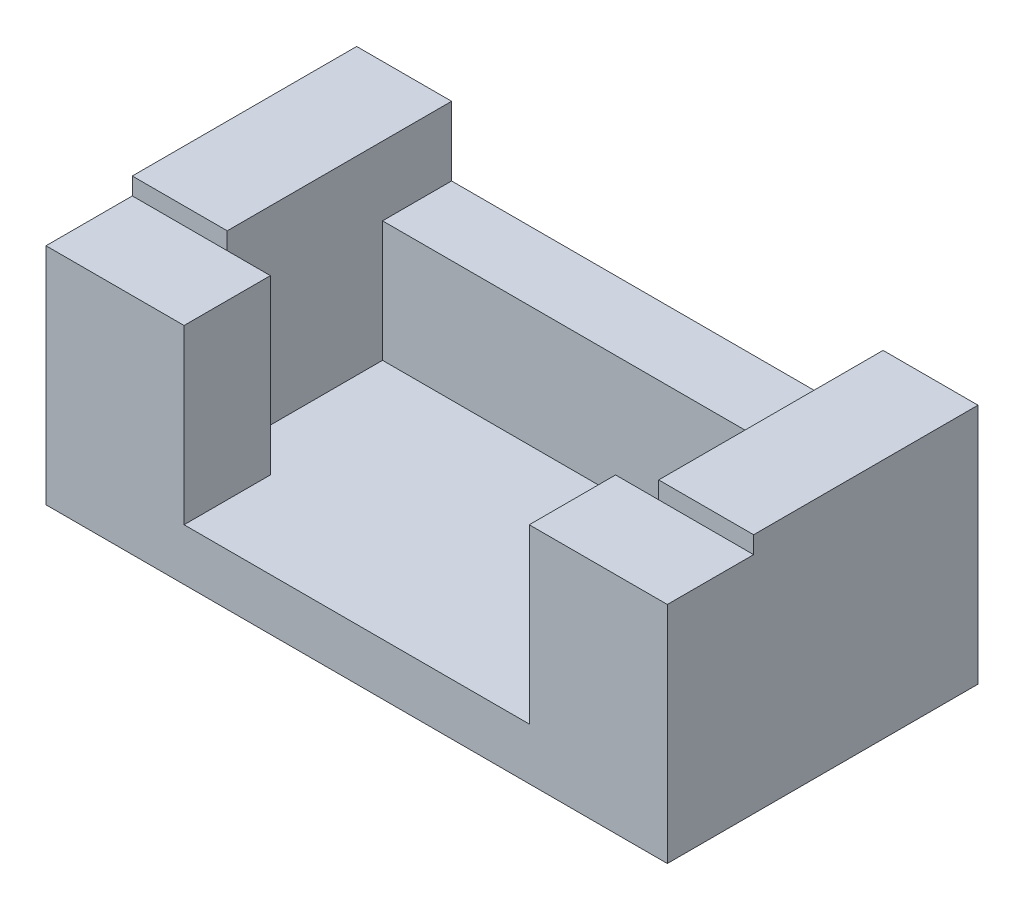
ISO-10303-21;
HEADER;
FILE_DESCRIPTION(('STEP AP214'),'2;1');
FILE_NAME('part.step','',(''),(''),'','','');
FILE_SCHEMA(('AUTOMOTIVE_DESIGN { 1 0 10303 214 1 1 1 1 }'));
ENDSEC;
DATA;
#1=APPLICATION_CONTEXT('core data for automotive mechanical design processes');
#2=APPLICATION_PROTOCOL_DEFINITION('international standard','automotive_design',2000,#1);
#3=PRODUCT_CONTEXT('',#1,'mechanical');
#4=PRODUCT('Part','Part','',(#3));
#5=PRODUCT_RELATED_PRODUCT_CATEGORY('part','',(#4));
#6=PRODUCT_DEFINITION_FORMATION('','',#4);
#7=PRODUCT_DEFINITION_CONTEXT('part definition',#1,'design');
#8=PRODUCT_DEFINITION('design','',#6,#7);
#9=PRODUCT_DEFINITION_SHAPE('','',#8);
#10=(LENGTH_UNIT() NAMED_UNIT(*) SI_UNIT(.MILLI.,.METRE.));
#11=(NAMED_UNIT(*) PLANE_ANGLE_UNIT() SI_UNIT($,.RADIAN.));
#12=(NAMED_UNIT(*) SI_UNIT($,.STERADIAN.) SOLID_ANGLE_UNIT());
#13=UNCERTAINTY_MEASURE_WITH_UNIT(LENGTH_MEASURE(1.E-05),#10,'distance_accuracy_value','');
#14=(GEOMETRIC_REPRESENTATION_CONTEXT(3) GLOBAL_UNCERTAINTY_ASSIGNED_CONTEXT((#13)) GLOBAL_UNIT_ASSIGNED_CONTEXT((#10,
#11,#12)) REPRESENTATION_CONTEXT('',''));
#15=CARTESIAN_POINT('',(0.,0.,0.));
#16=DIRECTION('',(0.,0.,1.));
#17=DIRECTION('',(1.,0.,0.));
#18=AXIS2_PLACEMENT_3D('',#15,#16,#17);
#19=CARTESIAN_POINT('',(0.,14.,0.));
#20=DIRECTION('',(0.,1.,0.));
#21=DIRECTION('',(0.,0.,1.));
#22=AXIS2_PLACEMENT_3D('',#19,#20,#21);
#23=PLANE('',#22);
#24=DIRECTION('',(0.,0.,-1.));
#25=VECTOR('',#24,1.);
#26=CARTESIAN_POINT('',(-12.5,14.,4.));
#27=LINE('',#26,#25);
#28=CARTESIAN_POINT('',(-12.5,14.,4.));
#29=VERTEX_POINT('',#28);
#30=CARTESIAN_POINT('',(-12.5,14.,-9.));
#31=VERTEX_POINT('',#30);
#32=EDGE_CURVE('E314',#29,#31,#27,.T.);
#33=ORIENTED_EDGE('',*,*,#32,.T.);
#34=DIRECTION('',(-1.,0.,0.));
#35=VECTOR('',#34,1.);
#36=CARTESIAN_POINT('',(18.,14.,-9.));
#37=LINE('',#36,#35);
#38=CARTESIAN_POINT('',(-18.,14.,-9.));
#39=VERTEX_POINT('',#38);
#40=EDGE_CURVE('E334',#31,#39,#37,.T.);
#41=ORIENTED_EDGE('',*,*,#40,.T.);
#42=DIRECTION('',(0.,0.,1.));
#43=VECTOR('',#42,1.);
#44=CARTESIAN_POINT('',(-18.,14.,-9.));
#45=LINE('',#44,#43);
#46=CARTESIAN_POINT('',(-18.,14.,4.));
#47=VERTEX_POINT('',#46);
#48=EDGE_CURVE('E273',#39,#47,#45,.T.);
#49=ORIENTED_EDGE('',*,*,#48,.T.);
#50=DIRECTION('',(1.,0.,0.));
#51=VECTOR('',#50,1.);
#52=CARTESIAN_POINT('',(-18.,14.,4.));
#53=LINE('',#52,#51);
#54=EDGE_CURVE('E310',#47,#29,#53,.T.);
#55=ORIENTED_EDGE('',*,*,#54,.T.);
#56=EDGE_LOOP('',(#33,#41,#49,#55));
#57=FACE_BOUND('',#56,.T.);
#58=ADVANCED_FACE('F36',(#57),#23,.T.);
#59=CARTESIAN_POINT('',(0.,3.,0.));
#60=DIRECTION('',(0.,1.,0.));
#61=DIRECTION('',(0.,0.,1.));
#62=AXIS2_PLACEMENT_3D('',#59,#60,#61);
#63=PLANE('',#62);
#64=DIRECTION('',(1.,0.,0.));
#65=VECTOR('',#64,1.);
#66=CARTESIAN_POINT('',(-12.5,3.,-5.));
#67=LINE('',#66,#65);
#68=CARTESIAN_POINT('',(-12.5,3.,-5.));
#69=VERTEX_POINT('',#68);
#70=CARTESIAN_POINT('',(12.5,3.,-5.));
#71=VERTEX_POINT('',#70);
#72=EDGE_CURVE('E329',#69,#71,#67,.T.);
#73=ORIENTED_EDGE('',*,*,#72,.F.);
#74=DIRECTION('',(0.,0.,-1.));
#75=VECTOR('',#74,1.);
#76=CARTESIAN_POINT('',(-12.5,3.,4.));
#77=LINE('',#76,#75);
#78=CARTESIAN_POINT('',(-12.5,3.,4.));
#79=VERTEX_POINT('',#78);
#80=EDGE_CURVE('E184',#79,#69,#77,.T.);
#81=ORIENTED_EDGE('',*,*,#80,.F.);
#82=DIRECTION('',(-1.,0.,0.));
#83=VECTOR('',#82,1.);
#84=CARTESIAN_POINT('',(-18.,3.,4.));
#85=LINE('',#84,#83);
#86=CARTESIAN_POINT('',(-10.,3.,4.));
#87=VERTEX_POINT('',#86);
#88=EDGE_CURVE('E40',#87,#79,#85,.T.);
#89=ORIENTED_EDGE('',*,*,#88,.F.);
#90=DIRECTION('',(0.,0.,-1.));
#91=VECTOR('',#90,1.);
#92=CARTESIAN_POINT('',(-10.,3.,9.));
#93=LINE('',#92,#91);
#94=CARTESIAN_POINT('',(-10.,3.,9.));
#95=VERTEX_POINT('',#94);
#96=EDGE_CURVE('E216',#95,#87,#93,.T.);
#97=ORIENTED_EDGE('',*,*,#96,.F.);
#98=DIRECTION('',(1.,0.,0.));
#99=VECTOR('',#98,1.);
#100=CARTESIAN_POINT('',(-18.,3.,9.));
#101=LINE('',#100,#99);
#102=CARTESIAN_POINT('',(10.,3.,9.));
#103=VERTEX_POINT('',#102);
#104=EDGE_CURVE('E238',#95,#103,#101,.T.);
#105=ORIENTED_EDGE('',*,*,#104,.T.);
#106=DIRECTION('',(0.,0.,1.));
#107=VECTOR('',#106,1.);
#108=CARTESIAN_POINT('',(10.,3.,9.));
#109=LINE('',#108,#107);
#110=CARTESIAN_POINT('',(10.,3.,4.));
#111=VERTEX_POINT('',#110);
#112=EDGE_CURVE('E200',#111,#103,#109,.T.);
#113=ORIENTED_EDGE('',*,*,#112,.F.);
#114=DIRECTION('',(-1.,0.,0.));
#115=VECTOR('',#114,1.);
#116=CARTESIAN_POINT('',(18.,3.,3.99999999999999));
#117=LINE('',#116,#115);
#118=CARTESIAN_POINT('',(12.5,3.,4.));
#119=VERTEX_POINT('',#118);
#120=EDGE_CURVE('E62',#119,#111,#117,.T.);
#121=ORIENTED_EDGE('',*,*,#120,.F.);
#122=DIRECTION('',(0.,0.,1.));
#123=VECTOR('',#122,1.);
#124=CARTESIAN_POINT('',(12.5,3.,-5.));
#125=LINE('',#124,#123);
#126=EDGE_CURVE('E332',#71,#119,#125,.T.);
#127=ORIENTED_EDGE('',*,*,#126,.F.);
#128=EDGE_LOOP('',(#73,#81,#89,#97,#105,#113,#121,#127));
#129=FACE_BOUND('',#128,.T.);
#130=ADVANCED_FACE('F295',(#129),#63,.T.);
#131=CARTESIAN_POINT('',(-18.,13.,4.));
#132=DIRECTION('',(0.,0.,1.));
#133=DIRECTION('',(1.,0.,0.));
#134=AXIS2_PLACEMENT_3D('',#131,#132,#133);
#135=PLANE('',#134);
#136=DIRECTION('',(0.,-1.,0.));
#137=VECTOR('',#136,1.);
#138=CARTESIAN_POINT('',(-12.5,14.,4.));
#139=LINE('',#138,#137);
#140=CARTESIAN_POINT('',(-12.5,13.,4.));
#141=VERTEX_POINT('',#140);
#142=EDGE_CURVE('E186',#141,#79,#139,.T.);
#143=ORIENTED_EDGE('',*,*,#142,.F.);
#144=DIRECTION('',(-1.,0.,0.));
#145=VECTOR('',#144,1.);
#146=CARTESIAN_POINT('',(-18.,13.,4.));
#147=LINE('',#146,#145);
#148=CARTESIAN_POINT('',(-10.,13.,4.));
#149=VERTEX_POINT('',#148);
#150=EDGE_CURVE('E225',#149,#141,#147,.T.);
#151=ORIENTED_EDGE('',*,*,#150,.F.);
#152=DIRECTION('',(0.,-1.,0.));
#153=VECTOR('',#152,1.);
#154=CARTESIAN_POINT('',(-10.,13.,4.));
#155=LINE('',#154,#153);
#156=EDGE_CURVE('E227',#149,#87,#155,.T.);
#157=ORIENTED_EDGE('',*,*,#156,.T.);
#158=ORIENTED_EDGE('',*,*,#88,.T.);
#159=EDGE_LOOP('',(#143,#151,#157,#158));
#160=FACE_BOUND('',#159,.T.);
#161=ADVANCED_FACE('F302',(#160),#135,.F.);
#162=CARTESIAN_POINT('',(18.,13.,3.99999999999999));
#163=DIRECTION('',(0.,0.,1.));
#164=DIRECTION('',(1.,0.,0.));
#165=AXIS2_PLACEMENT_3D('',#162,#163,#164);
#166=PLANE('',#165);
#167=DIRECTION('',(0.,-1.,0.));
#168=VECTOR('',#167,1.);
#169=CARTESIAN_POINT('',(12.5,14.,4.));
#170=LINE('',#169,#168);
#171=CARTESIAN_POINT('',(12.5,13.,4.));
#172=VERTEX_POINT('',#171);
#173=EDGE_CURVE('E335',#172,#119,#170,.T.);
#174=ORIENTED_EDGE('',*,*,#173,.T.);
#175=ORIENTED_EDGE('',*,*,#120,.T.);
#176=DIRECTION('',(0.,-1.,0.));
#177=VECTOR('',#176,1.);
#178=CARTESIAN_POINT('',(10.,13.,4.));
#179=LINE('',#178,#177);
#180=CARTESIAN_POINT('',(10.,13.,4.));
#181=VERTEX_POINT('',#180);
#182=EDGE_CURVE('E214',#181,#111,#179,.T.);
#183=ORIENTED_EDGE('',*,*,#182,.F.);
#184=DIRECTION('',(-1.,0.,0.));
#185=VECTOR('',#184,1.);
#186=CARTESIAN_POINT('',(18.,13.,3.99999999999999));
#187=LINE('',#186,#185);
#188=EDGE_CURVE('E203',#172,#181,#187,.T.);
#189=ORIENTED_EDGE('',*,*,#188,.F.);
#190=EDGE_LOOP('',(#174,#175,#183,#189));
#191=FACE_BOUND('',#190,.T.);
#192=ADVANCED_FACE('F337',(#191),#166,.F.);
#193=CARTESIAN_POINT('',(18.,3.,-9.));
#194=DIRECTION('',(-1.,0.,0.));
#195=DIRECTION('',(0.,0.,1.));
#196=AXIS2_PLACEMENT_3D('',#193,#194,#195);
#197=PLANE('',#196);
#198=DIRECTION('',(0.,-1.,0.));
#199=VECTOR('',#198,1.);
#200=CARTESIAN_POINT('',(18.,3.,-9.));
#201=LINE('',#200,#199);
#202=CARTESIAN_POINT('',(18.,14.,-9.));
#203=VERTEX_POINT('',#202);
#204=CARTESIAN_POINT('',(18.,0.,-9.));
#205=VERTEX_POINT('',#204);
#206=EDGE_CURVE('E11',#203,#205,#201,.T.);
#207=ORIENTED_EDGE('',*,*,#206,.F.);
#208=DIRECTION('',(0.,0.,-1.));
#209=VECTOR('',#208,1.);
#210=CARTESIAN_POINT('',(18.,14.,4.));
#211=LINE('',#210,#209);
#212=CARTESIAN_POINT('',(18.,14.,4.));
#213=VERTEX_POINT('',#212);
#214=EDGE_CURVE('E325',#213,#203,#211,.T.);
#215=ORIENTED_EDGE('',*,*,#214,.F.);
#216=DIRECTION('',(0.,-1.,0.));
#217=VECTOR('',#216,1.);
#218=CARTESIAN_POINT('',(18.,14.,4.));
#219=LINE('',#218,#217);
#220=CARTESIAN_POINT('',(18.,13.,4.));
#221=VERTEX_POINT('',#220);
#222=EDGE_CURVE('E286',#213,#221,#219,.T.);
#223=ORIENTED_EDGE('',*,*,#222,.T.);
#224=DIRECTION('',(0.,0.,-1.));
#225=VECTOR('',#224,1.);
#226=CARTESIAN_POINT('',(18.,13.,8.99999999999999));
#227=LINE('',#226,#225);
#228=CARTESIAN_POINT('',(18.,13.,8.99999999999999));
#229=VERTEX_POINT('',#228);
#230=EDGE_CURVE('E199',#229,#221,#227,.T.);
#231=ORIENTED_EDGE('',*,*,#230,.F.);
#232=DIRECTION('',(0.,-1.,0.));
#233=VECTOR('',#232,1.);
#234=CARTESIAN_POINT('',(18.,3.,9.));
#235=LINE('',#234,#233);
#236=CARTESIAN_POINT('',(18.,0.,9.));
#237=VERTEX_POINT('',#236);
#238=EDGE_CURVE('E241',#229,#237,#235,.T.);
#239=ORIENTED_EDGE('',*,*,#238,.T.);
#240=DIRECTION('',(0.,0.,-1.));
#241=VECTOR('',#240,1.);
#242=CARTESIAN_POINT('',(18.,0.,-9.));
#243=LINE('',#242,#241);
#244=EDGE_CURVE('E235',#237,#205,#243,.T.);
#245=ORIENTED_EDGE('',*,*,#244,.T.);
#246=EDGE_LOOP('',(#207,#215,#223,#231,#239,#245));
#247=FACE_BOUND('',#246,.T.);
#248=ADVANCED_FACE('F38',(#247),#197,.F.);
#249=CARTESIAN_POINT('',(-18.,3.,-9.));
#250=DIRECTION('',(0.,0.,1.));
#251=DIRECTION('',(1.,0.,0.));
#252=AXIS2_PLACEMENT_3D('',#249,#250,#251);
#253=PLANE('',#252);
#254=ORIENTED_EDGE('',*,*,#40,.F.);
#255=DIRECTION('',(0.,1.,0.));
#256=VECTOR('',#255,1.);
#257=CARTESIAN_POINT('',(-12.5,10.,-9.));
#258=LINE('',#257,#256);
#259=CARTESIAN_POINT('',(-12.5,10.,-9.));
#260=VERTEX_POINT('',#259);
#261=EDGE_CURVE('E330',#260,#31,#258,.T.);
#262=ORIENTED_EDGE('',*,*,#261,.F.);
#263=DIRECTION('',(-1.,0.,0.));
#264=VECTOR('',#263,1.);
#265=CARTESIAN_POINT('',(-12.5,10.,-9.));
#266=LINE('',#265,#264);
#267=CARTESIAN_POINT('',(12.5,10.,-9.));
#268=VERTEX_POINT('',#267);
#269=EDGE_CURVE('E168',#268,#260,#266,.T.);
#270=ORIENTED_EDGE('',*,*,#269,.F.);
#271=DIRECTION('',(0.,1.,0.));
#272=VECTOR('',#271,1.);
#273=CARTESIAN_POINT('',(12.5,10.,-9.));
#274=LINE('',#273,#272);
#275=CARTESIAN_POINT('',(12.5,14.,-9.));
#276=VERTEX_POINT('',#275);
#277=EDGE_CURVE('E342',#268,#276,#274,.T.);
#278=ORIENTED_EDGE('',*,*,#277,.T.);
#279=EDGE_CURVE('E318',#203,#276,#37,.T.);
#280=ORIENTED_EDGE('',*,*,#279,.F.);
#281=ORIENTED_EDGE('',*,*,#206,.T.);
#282=DIRECTION('',(-1.,0.,0.));
#283=VECTOR('',#282,1.);
#284=CARTESIAN_POINT('',(-18.,0.,-9.));
#285=LINE('',#284,#283);
#286=CARTESIAN_POINT('',(-18.,0.,-9.));
#287=VERTEX_POINT('',#286);
#288=EDGE_CURVE('E254',#205,#287,#285,.T.);
#289=ORIENTED_EDGE('',*,*,#288,.T.);
#290=DIRECTION('',(0.,-1.,0.));
#291=VECTOR('',#290,1.);
#292=CARTESIAN_POINT('',(-18.,3.,-9.));
#293=LINE('',#292,#291);
#294=EDGE_CURVE('E46',#39,#287,#293,.T.);
#295=ORIENTED_EDGE('',*,*,#294,.F.);
#296=EDGE_LOOP('',(#254,#262,#270,#278,#280,#281,#289,#295));
#297=FACE_BOUND('',#296,.T.);
#298=ADVANCED_FACE('F350',(#297),#253,.F.);
#299=CARTESIAN_POINT('',(-18.,3.,-9.));
#300=DIRECTION('',(1.,0.,0.));
#301=DIRECTION('',(0.,0.,-1.));
#302=AXIS2_PLACEMENT_3D('',#299,#300,#301);
#303=PLANE('',#302);
#304=DIRECTION('',(0.,0.,1.));
#305=VECTOR('',#304,1.);
#306=CARTESIAN_POINT('',(-18.,0.,-9.));
#307=LINE('',#306,#305);
#308=CARTESIAN_POINT('',(-18.,0.,9.));
#309=VERTEX_POINT('',#308);
#310=EDGE_CURVE('E258',#287,#309,#307,.T.);
#311=ORIENTED_EDGE('',*,*,#310,.T.);
#312=DIRECTION('',(0.,-1.,0.));
#313=VECTOR('',#312,1.);
#314=CARTESIAN_POINT('',(-18.,3.,9.));
#315=LINE('',#314,#313);
#316=CARTESIAN_POINT('',(-18.,13.,9.));
#317=VERTEX_POINT('',#316);
#318=EDGE_CURVE('E266',#317,#309,#315,.T.);
#319=ORIENTED_EDGE('',*,*,#318,.F.);
#320=DIRECTION('',(0.,0.,1.));
#321=VECTOR('',#320,1.);
#322=CARTESIAN_POINT('',(-18.,13.,9.));
#323=LINE('',#322,#321);
#324=CARTESIAN_POINT('',(-18.,13.,4.));
#325=VERTEX_POINT('',#324);
#326=EDGE_CURVE('E217',#325,#317,#323,.T.);
#327=ORIENTED_EDGE('',*,*,#326,.F.);
#328=DIRECTION('',(0.,-1.,0.));
#329=VECTOR('',#328,1.);
#330=CARTESIAN_POINT('',(-18.,14.,4.));
#331=LINE('',#330,#329);
#332=EDGE_CURVE('E194',#47,#325,#331,.T.);
#333=ORIENTED_EDGE('',*,*,#332,.F.);
#334=ORIENTED_EDGE('',*,*,#48,.F.);
#335=ORIENTED_EDGE('',*,*,#294,.T.);
#336=EDGE_LOOP('',(#311,#319,#327,#333,#334,#335));
#337=FACE_BOUND('',#336,.T.);
#338=ADVANCED_FACE('F271',(#337),#303,.F.);
#339=CARTESIAN_POINT('',(-18.,3.,9.));
#340=DIRECTION('',(0.,0.,-1.));
#341=DIRECTION('',(-1.,0.,0.));
#342=AXIS2_PLACEMENT_3D('',#339,#340,#341);
#343=PLANE('',#342);
#344=DIRECTION('',(1.,0.,0.));
#345=VECTOR('',#344,1.);
#346=CARTESIAN_POINT('',(-18.,0.,9.));
#347=LINE('',#346,#345);
#348=EDGE_CURVE('E242',#309,#237,#347,.T.);
#349=ORIENTED_EDGE('',*,*,#348,.T.);
#350=ORIENTED_EDGE('',*,*,#238,.F.);
#351=DIRECTION('',(1.,0.,0.));
#352=VECTOR('',#351,1.);
#353=CARTESIAN_POINT('',(18.,13.,8.99999999999999));
#354=LINE('',#353,#352);
#355=CARTESIAN_POINT('',(10.,13.,9.));
#356=VERTEX_POINT('',#355);
#357=EDGE_CURVE('E196',#356,#229,#354,.T.);
#358=ORIENTED_EDGE('',*,*,#357,.F.);
#359=DIRECTION('',(0.,-1.,0.));
#360=VECTOR('',#359,1.);
#361=CARTESIAN_POINT('',(10.,13.,9.));
#362=LINE('',#361,#360);
#363=EDGE_CURVE('E209',#356,#103,#362,.T.);
#364=ORIENTED_EDGE('',*,*,#363,.T.);
#365=ORIENTED_EDGE('',*,*,#104,.F.);
#366=DIRECTION('',(0.,-1.,0.));
#367=VECTOR('',#366,1.);
#368=CARTESIAN_POINT('',(-10.,13.,9.));
#369=LINE('',#368,#367);
#370=CARTESIAN_POINT('',(-10.,13.,9.));
#371=VERTEX_POINT('',#370);
#372=EDGE_CURVE('E232',#371,#95,#369,.T.);
#373=ORIENTED_EDGE('',*,*,#372,.F.);
#374=DIRECTION('',(1.,0.,0.));
#375=VECTOR('',#374,1.);
#376=CARTESIAN_POINT('',(-18.,13.,9.));
#377=LINE('',#376,#375);
#378=EDGE_CURVE('E220',#317,#371,#377,.T.);
#379=ORIENTED_EDGE('',*,*,#378,.F.);
#380=ORIENTED_EDGE('',*,*,#318,.T.);
#381=EDGE_LOOP('',(#349,#350,#358,#364,#365,#373,#379,#380));
#382=FACE_BOUND('',#381,.T.);
#383=ADVANCED_FACE('F279',(#382),#343,.F.);
#384=CARTESIAN_POINT('',(0.,0.,0.));
#385=DIRECTION('',(0.,1.,0.));
#386=DIRECTION('',(0.,0.,1.));
#387=AXIS2_PLACEMENT_3D('',#384,#385,#386);
#388=PLANE('',#387);
#389=ORIENTED_EDGE('',*,*,#244,.F.);
#390=ORIENTED_EDGE('',*,*,#348,.F.);
#391=ORIENTED_EDGE('',*,*,#310,.F.);
#392=ORIENTED_EDGE('',*,*,#288,.F.);
#393=EDGE_LOOP('',(#389,#390,#391,#392));
#394=FACE_BOUND('',#393,.T.);
#395=ADVANCED_FACE('F277',(#394),#388,.F.);
#396=CARTESIAN_POINT('',(-10.,13.,9.));
#397=DIRECTION('',(-1.,0.,0.));
#398=DIRECTION('',(0.,0.,1.));
#399=AXIS2_PLACEMENT_3D('',#396,#397,#398);
#400=PLANE('',#399);
#401=ORIENTED_EDGE('',*,*,#96,.T.);
#402=ORIENTED_EDGE('',*,*,#156,.F.);
#403=DIRECTION('',(0.,0.,-1.));
#404=VECTOR('',#403,1.);
#405=CARTESIAN_POINT('',(-10.,13.,9.));
#406=LINE('',#405,#404);
#407=EDGE_CURVE('E222',#371,#149,#406,.T.);
#408=ORIENTED_EDGE('',*,*,#407,.F.);
#409=ORIENTED_EDGE('',*,*,#372,.T.);
#410=EDGE_LOOP('',(#401,#402,#408,#409));
#411=FACE_BOUND('',#410,.T.);
#412=ADVANCED_FACE('F298',(#411),#400,.F.);
#413=CARTESIAN_POINT('',(0.,13.,0.));
#414=DIRECTION('',(0.,-1.,0.));
#415=DIRECTION('',(0.,0.,-1.));
#416=AXIS2_PLACEMENT_3D('',#413,#414,#415);
#417=PLANE('',#416);
#418=ORIENTED_EDGE('',*,*,#326,.T.);
#419=ORIENTED_EDGE('',*,*,#378,.T.);
#420=ORIENTED_EDGE('',*,*,#407,.T.);
#421=ORIENTED_EDGE('',*,*,#150,.T.);
#422=EDGE_CURVE('E224',#141,#325,#147,.T.);
#423=ORIENTED_EDGE('',*,*,#422,.T.);
#424=EDGE_LOOP('',(#418,#419,#420,#421,#423));
#425=FACE_BOUND('',#424,.T.);
#426=ADVANCED_FACE('F305',(#425),#417,.F.);
#427=CARTESIAN_POINT('',(10.,13.,9.));
#428=DIRECTION('',(1.,0.,0.));
#429=DIRECTION('',(0.,0.,-1.));
#430=AXIS2_PLACEMENT_3D('',#427,#428,#429);
#431=PLANE('',#430);
#432=ORIENTED_EDGE('',*,*,#112,.T.);
#433=ORIENTED_EDGE('',*,*,#363,.F.);
#434=DIRECTION('',(0.,0.,1.));
#435=VECTOR('',#434,1.);
#436=CARTESIAN_POINT('',(10.,13.,9.));
#437=LINE('',#436,#435);
#438=EDGE_CURVE('E207',#181,#356,#437,.T.);
#439=ORIENTED_EDGE('',*,*,#438,.F.);
#440=ORIENTED_EDGE('',*,*,#182,.T.);
#441=EDGE_LOOP('',(#432,#433,#439,#440));
#442=FACE_BOUND('',#441,.T.);
#443=ADVANCED_FACE('F353',(#442),#431,.F.);
#444=CARTESIAN_POINT('',(0.,13.,0.));
#445=DIRECTION('',(0.,-1.,0.));
#446=DIRECTION('',(0.,0.,-1.));
#447=AXIS2_PLACEMENT_3D('',#444,#445,#446);
#448=PLANE('',#447);
#449=ORIENTED_EDGE('',*,*,#357,.T.);
#450=ORIENTED_EDGE('',*,*,#230,.T.);
#451=EDGE_CURVE('E204',#221,#172,#187,.T.);
#452=ORIENTED_EDGE('',*,*,#451,.T.);
#453=ORIENTED_EDGE('',*,*,#188,.T.);
#454=ORIENTED_EDGE('',*,*,#438,.T.);
#455=EDGE_LOOP('',(#449,#450,#452,#453,#454));
#456=FACE_BOUND('',#455,.T.);
#457=ADVANCED_FACE('F288',(#456),#448,.F.);
#458=CARTESIAN_POINT('',(-18.,14.,4.));
#459=DIRECTION('',(0.,0.,-1.));
#460=DIRECTION('',(-1.,0.,0.));
#461=AXIS2_PLACEMENT_3D('',#458,#459,#460);
#462=PLANE('',#461);
#463=ORIENTED_EDGE('',*,*,#332,.T.);
#464=ORIENTED_EDGE('',*,*,#422,.F.);
#465=EDGE_CURVE('E188',#29,#141,#139,.T.);
#466=ORIENTED_EDGE('',*,*,#465,.F.);
#467=ORIENTED_EDGE('',*,*,#54,.F.);
#468=EDGE_LOOP('',(#463,#464,#466,#467));
#469=FACE_BOUND('',#468,.T.);
#470=ADVANCED_FACE('F311',(#469),#462,.F.);
#471=CARTESIAN_POINT('',(12.5,14.,4.));
#472=DIRECTION('',(0.,0.,-1.));
#473=DIRECTION('',(-1.,0.,0.));
#474=AXIS2_PLACEMENT_3D('',#471,#472,#473);
#475=PLANE('',#474);
#476=CARTESIAN_POINT('',(12.5,14.,4.));
#477=VERTEX_POINT('',#476);
#478=EDGE_CURVE('E54',#477,#172,#170,.T.);
#479=ORIENTED_EDGE('',*,*,#478,.T.);
#480=ORIENTED_EDGE('',*,*,#451,.F.);
#481=ORIENTED_EDGE('',*,*,#222,.F.);
#482=DIRECTION('',(1.,0.,0.));
#483=VECTOR('',#482,1.);
#484=CARTESIAN_POINT('',(12.5,14.,4.));
#485=LINE('',#484,#483);
#486=EDGE_CURVE('E323',#477,#213,#485,.T.);
#487=ORIENTED_EDGE('',*,*,#486,.F.);
#488=EDGE_LOOP('',(#479,#480,#481,#487));
#489=FACE_BOUND('',#488,.T.);
#490=ADVANCED_FACE('F352',(#489),#475,.F.);
#491=CARTESIAN_POINT('',(-12.5,14.,4.));
#492=DIRECTION('',(-1.,0.,0.));
#493=DIRECTION('',(0.,0.,1.));
#494=AXIS2_PLACEMENT_3D('',#491,#492,#493);
#495=PLANE('',#494);
#496=ORIENTED_EDGE('',*,*,#80,.T.);
#497=DIRECTION('',(0.,-1.,0.));
#498=VECTOR('',#497,1.);
#499=CARTESIAN_POINT('',(-12.5,14.,-5.));
#500=LINE('',#499,#498);
#501=CARTESIAN_POINT('',(-12.5,10.,-5.));
#502=VERTEX_POINT('',#501);
#503=EDGE_CURVE('E177',#502,#69,#500,.T.);
#504=ORIENTED_EDGE('',*,*,#503,.F.);
#505=DIRECTION('',(0.,0.,1.));
#506=VECTOR('',#505,1.);
#507=CARTESIAN_POINT('',(-12.5,10.,-5.));
#508=LINE('',#507,#506);
#509=EDGE_CURVE('E161',#260,#502,#508,.T.);
#510=ORIENTED_EDGE('',*,*,#509,.F.);
#511=ORIENTED_EDGE('',*,*,#261,.T.);
#512=ORIENTED_EDGE('',*,*,#32,.F.);
#513=ORIENTED_EDGE('',*,*,#465,.T.);
#514=ORIENTED_EDGE('',*,*,#142,.T.);
#515=EDGE_LOOP('',(#496,#504,#510,#511,#512,#513,#514));
#516=FACE_BOUND('',#515,.T.);
#517=ADVANCED_FACE('F182',(#516),#495,.F.);
#518=CARTESIAN_POINT('',(-12.5,14.,-5.));
#519=DIRECTION('',(0.,0.,-1.));
#520=DIRECTION('',(-1.,0.,0.));
#521=AXIS2_PLACEMENT_3D('',#518,#519,#520);
#522=PLANE('',#521);
#523=DIRECTION('',(0.,-1.,0.));
#524=VECTOR('',#523,1.);
#525=CARTESIAN_POINT('',(12.5,14.,-5.));
#526=LINE('',#525,#524);
#527=CARTESIAN_POINT('',(12.5,10.,-5.));
#528=VERTEX_POINT('',#527);
#529=EDGE_CURVE('E179',#528,#71,#526,.T.);
#530=ORIENTED_EDGE('',*,*,#529,.F.);
#531=DIRECTION('',(1.,0.,0.));
#532=VECTOR('',#531,1.);
#533=CARTESIAN_POINT('',(-12.5,10.,-5.));
#534=LINE('',#533,#532);
#535=EDGE_CURVE('E165',#502,#528,#534,.T.);
#536=ORIENTED_EDGE('',*,*,#535,.F.);
#537=ORIENTED_EDGE('',*,*,#503,.T.);
#538=ORIENTED_EDGE('',*,*,#72,.T.);
#539=EDGE_LOOP('',(#530,#536,#537,#538));
#540=FACE_BOUND('',#539,.T.);
#541=ADVANCED_FACE('F175',(#540),#522,.F.);
#542=CARTESIAN_POINT('',(12.5,14.,-5.));
#543=DIRECTION('',(1.,0.,0.));
#544=DIRECTION('',(0.,0.,-1.));
#545=AXIS2_PLACEMENT_3D('',#542,#543,#544);
#546=PLANE('',#545);
#547=ORIENTED_EDGE('',*,*,#126,.T.);
#548=ORIENTED_EDGE('',*,*,#173,.F.);
#549=ORIENTED_EDGE('',*,*,#478,.F.);
#550=DIRECTION('',(0.,0.,1.));
#551=VECTOR('',#550,1.);
#552=CARTESIAN_POINT('',(12.5,14.,-5.));
#553=LINE('',#552,#551);
#554=EDGE_CURVE('E316',#276,#477,#553,.T.);
#555=ORIENTED_EDGE('',*,*,#554,.F.);
#556=ORIENTED_EDGE('',*,*,#277,.F.);
#557=DIRECTION('',(0.,0.,-1.));
#558=VECTOR('',#557,1.);
#559=CARTESIAN_POINT('',(12.5,10.,-5.));
#560=LINE('',#559,#558);
#561=EDGE_CURVE('E180',#528,#268,#560,.T.);
#562=ORIENTED_EDGE('',*,*,#561,.F.);
#563=ORIENTED_EDGE('',*,*,#529,.T.);
#564=EDGE_LOOP('',(#547,#548,#549,#555,#556,#562,#563));
#565=FACE_BOUND('',#564,.T.);
#566=ADVANCED_FACE('F340',(#565),#546,.F.);
#567=ORIENTED_EDGE('',*,*,#279,.T.);
#568=ORIENTED_EDGE('',*,*,#554,.T.);
#569=ORIENTED_EDGE('',*,*,#486,.T.);
#570=ORIENTED_EDGE('',*,*,#214,.T.);
#571=EDGE_LOOP('',(#567,#568,#569,#570));
#572=FACE_BOUND('',#571,.T.);
#573=ADVANCED_FACE('F351',(#572),#23,.T.);
#574=CARTESIAN_POINT('',(0.,10.,0.));
#575=DIRECTION('',(0.,-1.,0.));
#576=DIRECTION('',(0.,0.,-1.));
#577=AXIS2_PLACEMENT_3D('',#574,#575,#576);
#578=PLANE('',#577);
#579=ORIENTED_EDGE('',*,*,#509,.T.);
#580=ORIENTED_EDGE('',*,*,#535,.T.);
#581=ORIENTED_EDGE('',*,*,#561,.T.);
#582=ORIENTED_EDGE('',*,*,#269,.T.);
#583=EDGE_LOOP('',(#579,#580,#581,#582));
#584=FACE_BOUND('',#583,.T.);
#585=ADVANCED_FACE('F163',(#584),#578,.F.);
#586=CLOSED_SHELL('',(#58,#130,#161,#192,#248,#298,#338,#383,#395,#412,#426,#443,#457,#470,#490,
#517,#541,#566,#573,#585));
#587=MANIFOLD_SOLID_BREP('B2',#586);
#588=ADVANCED_BREP_SHAPE_REPRESENTATION('',(#18,#587),#14);
#589=SHAPE_DEFINITION_REPRESENTATION(#9,#588);
ENDSEC;
END-ISO-10303-21;
